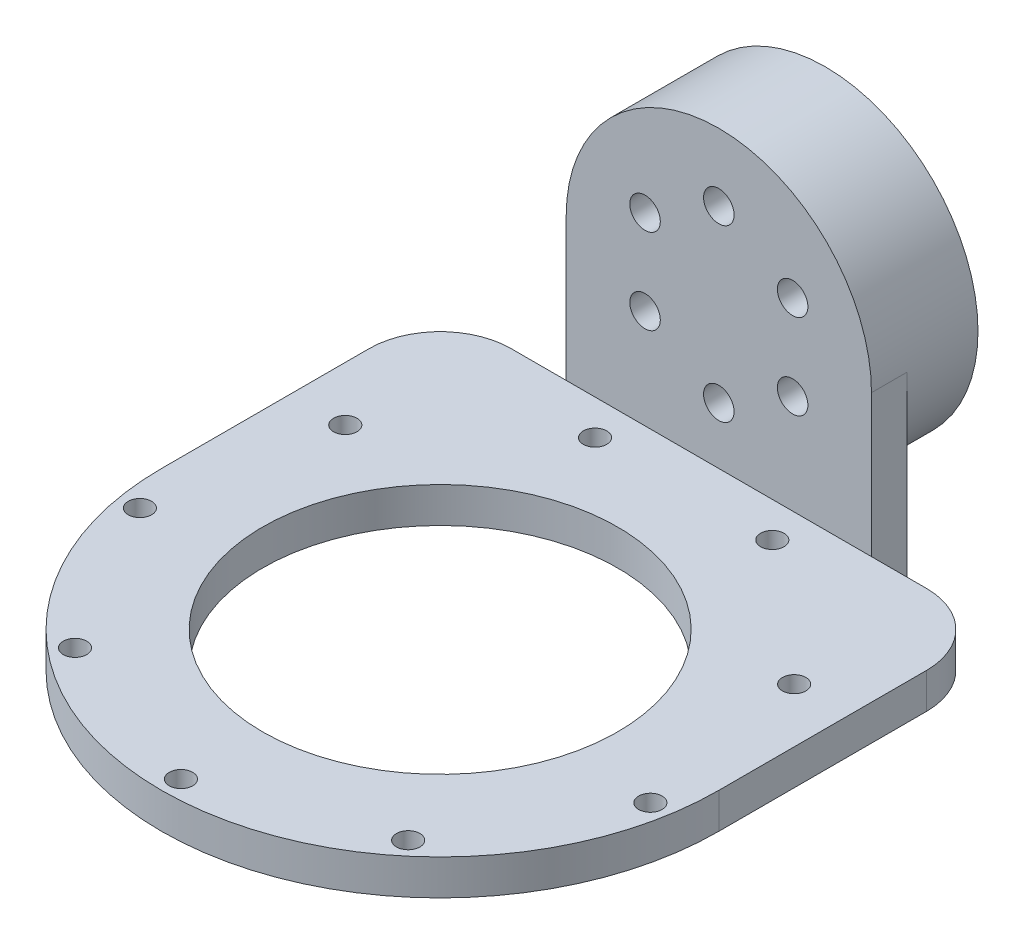
ISO-10303-21;
HEADER;
FILE_DESCRIPTION(('STEP AP214'),'2;1');
FILE_NAME('part.step','',(''),(''),'','','');
FILE_SCHEMA(('AUTOMOTIVE_DESIGN { 1 0 10303 214 1 1 1 1 }'));
ENDSEC;
DATA;
#1=APPLICATION_CONTEXT('core data for automotive mechanical design processes');
#2=APPLICATION_PROTOCOL_DEFINITION('international standard','automotive_design',2000,#1);
#3=PRODUCT_CONTEXT('',#1,'mechanical');
#4=PRODUCT('Part','Part','',(#3));
#5=PRODUCT_RELATED_PRODUCT_CATEGORY('part','',(#4));
#6=PRODUCT_DEFINITION_FORMATION('','',#4);
#7=PRODUCT_DEFINITION_CONTEXT('part definition',#1,'design');
#8=PRODUCT_DEFINITION('design','',#6,#7);
#9=PRODUCT_DEFINITION_SHAPE('','',#8);
#10=(LENGTH_UNIT() NAMED_UNIT(*) SI_UNIT(.MILLI.,.METRE.));
#11=(NAMED_UNIT(*) PLANE_ANGLE_UNIT() SI_UNIT($,.RADIAN.));
#12=(NAMED_UNIT(*) SI_UNIT($,.STERADIAN.) SOLID_ANGLE_UNIT());
#13=UNCERTAINTY_MEASURE_WITH_UNIT(LENGTH_MEASURE(1.E-05),#10,'distance_accuracy_value','');
#14=(GEOMETRIC_REPRESENTATION_CONTEXT(3) GLOBAL_UNCERTAINTY_ASSIGNED_CONTEXT((#13)) GLOBAL_UNIT_ASSIGNED_CONTEXT((#10,
#11,#12)) REPRESENTATION_CONTEXT('',''));
#15=CARTESIAN_POINT('',(0.,0.,0.));
#16=DIRECTION('',(0.,0.,1.));
#17=DIRECTION('',(1.,0.,0.));
#18=AXIS2_PLACEMENT_3D('',#15,#16,#17);
#19=CARTESIAN_POINT('',(0.,0.,15.));
#20=DIRECTION('',(0.,0.,1.));
#21=DIRECTION('',(1.,0.,0.));
#22=AXIS2_PLACEMENT_3D('',#19,#20,#21);
#23=PLANE('',#22);
#24=CARTESIAN_POINT('',(0.,12.,15.));
#25=DIRECTION('',(0.,0.,1.));
#26=DIRECTION('',(1.,0.,0.));
#27=AXIS2_PLACEMENT_3D('',#24,#25,#26);
#28=CIRCLE('',#27,2.15);
#29=CARTESIAN_POINT('',(2.15,12.,15.));
#30=VERTEX_POINT('',#29);
#31=EDGE_CURVE('E335',#30,#30,#28,.T.);
#32=ORIENTED_EDGE('',*,*,#31,.F.);
#33=EDGE_LOOP('',(#32));
#34=FACE_BOUND('',#33,.T.);
#35=CARTESIAN_POINT('',(-10.3923048454133,6.,15.));
#36=DIRECTION('',(0.,0.,1.));
#37=DIRECTION('',(1.,0.,0.));
#38=AXIS2_PLACEMENT_3D('',#35,#36,#37);
#39=CIRCLE('',#38,2.15);
#40=CARTESIAN_POINT('',(-8.24230484541326,6.,15.));
#41=VERTEX_POINT('',#40);
#42=EDGE_CURVE('E371',#41,#41,#39,.T.);
#43=ORIENTED_EDGE('',*,*,#42,.F.);
#44=EDGE_LOOP('',(#43));
#45=FACE_BOUND('',#44,.T.);
#46=CARTESIAN_POINT('',(-10.3923048454133,-6.00000000000001,15.));
#47=DIRECTION('',(0.,0.,1.));
#48=DIRECTION('',(1.,0.,0.));
#49=AXIS2_PLACEMENT_3D('',#46,#47,#48);
#50=CIRCLE('',#49,2.15);
#51=CARTESIAN_POINT('',(-8.24230484541326,-6.00000000000001,15.));
#52=VERTEX_POINT('',#51);
#53=EDGE_CURVE('E363',#52,#52,#50,.T.);
#54=ORIENTED_EDGE('',*,*,#53,.F.);
#55=EDGE_LOOP('',(#54));
#56=FACE_BOUND('',#55,.T.);
#57=CARTESIAN_POINT('',(0.,-12.,15.));
#58=DIRECTION('',(0.,0.,1.));
#59=DIRECTION('',(1.,0.,0.));
#60=AXIS2_PLACEMENT_3D('',#57,#58,#59);
#61=CIRCLE('',#60,2.15);
#62=CARTESIAN_POINT('',(2.15,-12.,15.));
#63=VERTEX_POINT('',#62);
#64=EDGE_CURVE('E355',#63,#63,#61,.T.);
#65=ORIENTED_EDGE('',*,*,#64,.F.);
#66=EDGE_LOOP('',(#65));
#67=FACE_BOUND('',#66,.T.);
#68=CARTESIAN_POINT('',(10.3923048454133,-6.,15.));
#69=DIRECTION('',(0.,0.,1.));
#70=DIRECTION('',(1.,0.,0.));
#71=AXIS2_PLACEMENT_3D('',#68,#69,#70);
#72=CIRCLE('',#71,2.15);
#73=CARTESIAN_POINT('',(12.5423048454133,-6.,15.));
#74=VERTEX_POINT('',#73);
#75=EDGE_CURVE('E347',#74,#74,#72,.T.);
#76=ORIENTED_EDGE('',*,*,#75,.F.);
#77=EDGE_LOOP('',(#76));
#78=FACE_BOUND('',#77,.T.);
#79=CARTESIAN_POINT('',(10.3923048454133,6.,15.));
#80=DIRECTION('',(0.,0.,1.));
#81=DIRECTION('',(1.,0.,0.));
#82=AXIS2_PLACEMENT_3D('',#79,#80,#81);
#83=CIRCLE('',#82,2.15);
#84=CARTESIAN_POINT('',(12.5423048454133,6.,15.));
#85=VERTEX_POINT('',#84);
#86=EDGE_CURVE('E339',#85,#85,#83,.T.);
#87=ORIENTED_EDGE('',*,*,#86,.F.);
#88=EDGE_LOOP('',(#87));
#89=FACE_BOUND('',#88,.T.);
#90=DIRECTION('',(0.,-1.,0.));
#91=VECTOR('',#90,1.);
#92=CARTESIAN_POINT('',(-21.5,0.,15.));
#93=LINE('',#92,#91);
#94=CARTESIAN_POINT('',(-21.5,0.,15.));
#95=VERTEX_POINT('',#94);
#96=CARTESIAN_POINT('',(-21.5,-20.,15.));
#97=VERTEX_POINT('',#96);
#98=EDGE_CURVE('E188',#95,#97,#93,.T.);
#99=ORIENTED_EDGE('',*,*,#98,.T.);
#100=DIRECTION('',(1.,0.,0.));
#101=VECTOR('',#100,1.);
#102=CARTESIAN_POINT('',(-39.25,-20.,15.));
#103=LINE('',#102,#101);
#104=CARTESIAN_POINT('',(21.5,-20.,15.));
#105=VERTEX_POINT('',#104);
#106=EDGE_CURVE('E167',#97,#105,#103,.T.);
#107=ORIENTED_EDGE('',*,*,#106,.T.);
#108=DIRECTION('',(0.,1.,0.));
#109=VECTOR('',#108,1.);
#110=CARTESIAN_POINT('',(21.5,0.,15.));
#111=LINE('',#110,#109);
#112=CARTESIAN_POINT('',(21.5,0.,15.));
#113=VERTEX_POINT('',#112);
#114=EDGE_CURVE('E192',#105,#113,#111,.T.);
#115=ORIENTED_EDGE('',*,*,#114,.T.);
#116=CARTESIAN_POINT('',(0.,0.,15.));
#117=DIRECTION('',(0.,0.,1.));
#118=DIRECTION('',(1.,0.,0.));
#119=AXIS2_PLACEMENT_3D('',#116,#117,#118);
#120=CIRCLE('',#119,21.5);
#121=EDGE_CURVE('E182',#113,#95,#120,.T.);
#122=ORIENTED_EDGE('',*,*,#121,.T.);
#123=EDGE_LOOP('',(#99,#107,#115,#122));
#124=FACE_BOUND('',#123,.T.);
#125=ADVANCED_FACE('F43',(#34,#45,#56,#67,#78,#89,#124),#23,.T.);
#126=CARTESIAN_POINT('',(0.,0.,10.));
#127=DIRECTION('',(0.,0.,-1.));
#128=DIRECTION('',(-1.,0.,0.));
#129=AXIS2_PLACEMENT_3D('',#126,#127,#128);
#130=CYLINDRICAL_SURFACE('',#129,21.5);
#131=CARTESIAN_POINT('',(0.,0.,10.));
#132=DIRECTION('',(0.,0.,1.));
#133=DIRECTION('',(1.,0.,0.));
#134=AXIS2_PLACEMENT_3D('',#131,#132,#133);
#135=CIRCLE('',#134,21.5);
#136=CARTESIAN_POINT('',(-21.5,0.,10.));
#137=VERTEX_POINT('',#136);
#138=CARTESIAN_POINT('',(21.5,0.,10.));
#139=VERTEX_POINT('',#138);
#140=EDGE_CURVE('E222',#137,#139,#135,.T.);
#141=ORIENTED_EDGE('',*,*,#140,.F.);
#142=DIRECTION('',(0.,0.,-1.));
#143=VECTOR('',#142,1.);
#144=CARTESIAN_POINT('',(-21.5,0.,15.));
#145=LINE('',#144,#143);
#146=EDGE_CURVE('E217',#95,#137,#145,.T.);
#147=ORIENTED_EDGE('',*,*,#146,.F.);
#148=ORIENTED_EDGE('',*,*,#121,.F.);
#149=DIRECTION('',(0.,0.,-1.));
#150=VECTOR('',#149,1.);
#151=CARTESIAN_POINT('',(21.5,0.,15.));
#152=LINE('',#151,#150);
#153=EDGE_CURVE('E197',#113,#139,#152,.T.);
#154=ORIENTED_EDGE('',*,*,#153,.T.);
#155=EDGE_LOOP('',(#141,#147,#148,#154));
#156=FACE_BOUND('',#155,.T.);
#157=CARTESIAN_POINT('',(0.,0.,0.));
#158=DIRECTION('',(0.,0.,1.));
#159=DIRECTION('',(1.,0.,0.));
#160=AXIS2_PLACEMENT_3D('',#157,#158,#159);
#161=CIRCLE('',#160,21.5);
#162=CARTESIAN_POINT('',(21.5,0.,0.));
#163=VERTEX_POINT('',#162);
#164=EDGE_CURVE('E221',#163,#163,#161,.T.);
#165=ORIENTED_EDGE('',*,*,#164,.T.);
#166=EDGE_LOOP('',(#165));
#167=FACE_BOUND('',#166,.T.);
#168=ADVANCED_FACE('F394',(#156,#167),#130,.T.);
#169=CARTESIAN_POINT('',(0.,0.,0.));
#170=DIRECTION('',(0.,0.,1.));
#171=DIRECTION('',(1.,0.,0.));
#172=AXIS2_PLACEMENT_3D('',#169,#170,#171);
#173=PLANE('',#172);
#174=CARTESIAN_POINT('',(0.,12.,0.));
#175=DIRECTION('',(0.,0.,1.));
#176=DIRECTION('',(1.,0.,0.));
#177=AXIS2_PLACEMENT_3D('',#174,#175,#176);
#178=CIRCLE('',#177,2.15);
#179=CARTESIAN_POINT('',(2.15,12.,0.));
#180=VERTEX_POINT('',#179);
#181=EDGE_CURVE('E331',#180,#180,#178,.T.);
#182=ORIENTED_EDGE('',*,*,#181,.T.);
#183=EDGE_LOOP('',(#182));
#184=FACE_BOUND('',#183,.T.);
#185=CARTESIAN_POINT('',(-10.3923048454133,6.,0.));
#186=DIRECTION('',(0.,0.,1.));
#187=DIRECTION('',(1.,0.,0.));
#188=AXIS2_PLACEMENT_3D('',#185,#186,#187);
#189=CIRCLE('',#188,2.15);
#190=CARTESIAN_POINT('',(-8.24230484541326,6.,0.));
#191=VERTEX_POINT('',#190);
#192=EDGE_CURVE('E375',#191,#191,#189,.T.);
#193=ORIENTED_EDGE('',*,*,#192,.T.);
#194=EDGE_LOOP('',(#193));
#195=FACE_BOUND('',#194,.T.);
#196=CARTESIAN_POINT('',(-10.3923048454133,-6.00000000000001,0.));
#197=DIRECTION('',(0.,0.,1.));
#198=DIRECTION('',(1.,0.,0.));
#199=AXIS2_PLACEMENT_3D('',#196,#197,#198);
#200=CIRCLE('',#199,2.15);
#201=CARTESIAN_POINT('',(-8.24230484541326,-6.00000000000001,0.));
#202=VERTEX_POINT('',#201);
#203=EDGE_CURVE('E367',#202,#202,#200,.T.);
#204=ORIENTED_EDGE('',*,*,#203,.T.);
#205=EDGE_LOOP('',(#204));
#206=FACE_BOUND('',#205,.T.);
#207=CARTESIAN_POINT('',(0.,-12.,0.));
#208=DIRECTION('',(0.,0.,1.));
#209=DIRECTION('',(1.,0.,0.));
#210=AXIS2_PLACEMENT_3D('',#207,#208,#209);
#211=CIRCLE('',#210,2.15);
#212=CARTESIAN_POINT('',(2.15,-12.,0.));
#213=VERTEX_POINT('',#212);
#214=EDGE_CURVE('E359',#213,#213,#211,.T.);
#215=ORIENTED_EDGE('',*,*,#214,.T.);
#216=EDGE_LOOP('',(#215));
#217=FACE_BOUND('',#216,.T.);
#218=CARTESIAN_POINT('',(10.3923048454133,-6.,0.));
#219=DIRECTION('',(0.,0.,1.));
#220=DIRECTION('',(1.,0.,0.));
#221=AXIS2_PLACEMENT_3D('',#218,#219,#220);
#222=CIRCLE('',#221,2.15);
#223=CARTESIAN_POINT('',(12.5423048454133,-6.,0.));
#224=VERTEX_POINT('',#223);
#225=EDGE_CURVE('E351',#224,#224,#222,.T.);
#226=ORIENTED_EDGE('',*,*,#225,.T.);
#227=EDGE_LOOP('',(#226));
#228=FACE_BOUND('',#227,.T.);
#229=CARTESIAN_POINT('',(10.3923048454133,6.,0.));
#230=DIRECTION('',(0.,0.,1.));
#231=DIRECTION('',(1.,0.,0.));
#232=AXIS2_PLACEMENT_3D('',#229,#230,#231);
#233=CIRCLE('',#232,2.15);
#234=CARTESIAN_POINT('',(12.5423048454133,6.,0.));
#235=VERTEX_POINT('',#234);
#236=EDGE_CURVE('E343',#235,#235,#233,.T.);
#237=ORIENTED_EDGE('',*,*,#236,.T.);
#238=EDGE_LOOP('',(#237));
#239=FACE_BOUND('',#238,.T.);
#240=ORIENTED_EDGE('',*,*,#164,.F.);
#241=EDGE_LOOP('',(#240));
#242=FACE_BOUND('',#241,.T.);
#243=ADVANCED_FACE('F381',(#184,#195,#206,#217,#228,#239,#242),#173,.F.);
#244=CARTESIAN_POINT('',(0.,0.,10.));
#245=DIRECTION('',(0.,0.,1.));
#246=DIRECTION('',(1.,0.,0.));
#247=AXIS2_PLACEMENT_3D('',#244,#245,#246);
#248=PLANE('',#247);
#249=DIRECTION('',(0.,-1.,0.));
#250=VECTOR('',#249,1.);
#251=CARTESIAN_POINT('',(-21.5,0.,10.));
#252=LINE('',#251,#250);
#253=CARTESIAN_POINT('',(-21.5,-25.,10.));
#254=VERTEX_POINT('',#253);
#255=EDGE_CURVE('E180',#137,#254,#252,.T.);
#256=ORIENTED_EDGE('',*,*,#255,.F.);
#257=ORIENTED_EDGE('',*,*,#140,.T.);
#258=DIRECTION('',(0.,1.,0.));
#259=VECTOR('',#258,1.);
#260=CARTESIAN_POINT('',(21.5,0.,10.));
#261=LINE('',#260,#259);
#262=CARTESIAN_POINT('',(21.5,-25.,10.));
#263=VERTEX_POINT('',#262);
#264=EDGE_CURVE('E187',#263,#139,#261,.T.);
#265=ORIENTED_EDGE('',*,*,#264,.F.);
#266=DIRECTION('',(1.,0.,0.));
#267=VECTOR('',#266,1.);
#268=CARTESIAN_POINT('',(21.5,-25.,10.));
#269=LINE('',#268,#267);
#270=EDGE_CURVE('E200',#254,#263,#269,.T.);
#271=ORIENTED_EDGE('',*,*,#270,.F.);
#272=EDGE_LOOP('',(#256,#257,#265,#271));
#273=FACE_BOUND('',#272,.T.);
#274=ADVANCED_FACE('F430',(#273),#248,.F.);
#275=CARTESIAN_POINT('',(-21.5,0.,15.));
#276=DIRECTION('',(1.,0.,0.));
#277=DIRECTION('',(0.,1.,0.));
#278=AXIS2_PLACEMENT_3D('',#275,#276,#277);
#279=PLANE('',#278);
#280=ORIENTED_EDGE('',*,*,#255,.T.);
#281=DIRECTION('',(0.,0.,-1.));
#282=VECTOR('',#281,1.);
#283=CARTESIAN_POINT('',(-21.5,-25.,15.));
#284=LINE('',#283,#282);
#285=CARTESIAN_POINT('',(-21.5,-25.,15.));
#286=VERTEX_POINT('',#285);
#287=EDGE_CURVE('E213',#286,#254,#284,.T.);
#288=ORIENTED_EDGE('',*,*,#287,.F.);
#289=EDGE_CURVE('E186',#97,#286,#93,.T.);
#290=ORIENTED_EDGE('',*,*,#289,.F.);
#291=ORIENTED_EDGE('',*,*,#98,.F.);
#292=ORIENTED_EDGE('',*,*,#146,.T.);
#293=EDGE_LOOP('',(#280,#288,#290,#291,#292));
#294=FACE_BOUND('',#293,.T.);
#295=ADVANCED_FACE('F412',(#294),#279,.F.);
#296=CARTESIAN_POINT('',(21.5,-25.,15.));
#297=DIRECTION('',(0.,1.,0.));
#298=DIRECTION('',(0.,0.,1.));
#299=AXIS2_PLACEMENT_3D('',#296,#297,#298);
#300=PLANE('',#299);
#301=CARTESIAN_POINT('',(0.,-25.,90.75));
#302=DIRECTION('',(0.,1.,0.));
#303=DIRECTION('',(0.,0.,1.));
#304=AXIS2_PLACEMENT_3D('',#301,#302,#303);
#305=CIRCLE('',#304,1.65);
#306=CARTESIAN_POINT('',(0.,-25.,92.4));
#307=VERTEX_POINT('',#306);
#308=EDGE_CURVE('E260',#307,#307,#305,.T.);
#309=ORIENTED_EDGE('',*,*,#308,.T.);
#310=EDGE_LOOP('',(#309));
#311=FACE_BOUND('',#310,.T.);
#312=CARTESIAN_POINT('',(-23.4617477535587,-25.,82.2106221738427));
#313=DIRECTION('',(0.,1.,0.));
#314=DIRECTION('',(0.,0.,1.));
#315=AXIS2_PLACEMENT_3D('',#312,#313,#314);
#316=CIRCLE('',#315,1.65000000000001);
#317=CARTESIAN_POINT('',(-23.4617477535587,-25.,83.8606221738427));
#318=VERTEX_POINT('',#317);
#319=EDGE_CURVE('E271',#318,#318,#316,.T.);
#320=ORIENTED_EDGE('',*,*,#319,.T.);
#321=EDGE_LOOP('',(#320));
#322=FACE_BOUND('',#321,.T.);
#323=CARTESIAN_POINT('',(-35.9454829849456,-25.,60.5881584848429));
#324=DIRECTION('',(0.,1.,0.));
#325=DIRECTION('',(0.,0.,1.));
#326=AXIS2_PLACEMENT_3D('',#323,#324,#325);
#327=CIRCLE('',#326,1.65);
#328=CARTESIAN_POINT('',(-35.9454829849456,-25.,62.2381584848429));
#329=VERTEX_POINT('',#328);
#330=EDGE_CURVE('E279',#329,#329,#327,.T.);
#331=ORIENTED_EDGE('',*,*,#330,.T.);
#332=EDGE_LOOP('',(#331));
#333=FACE_BOUND('',#332,.T.);
#334=CARTESIAN_POINT('',(-31.609927238132,-25.,35.9999999999999));
#335=DIRECTION('',(0.,1.,0.));
#336=DIRECTION('',(0.,0.,1.));
#337=AXIS2_PLACEMENT_3D('',#334,#335,#336);
#338=CIRCLE('',#337,1.65);
#339=CARTESIAN_POINT('',(-31.609927238132,-25.,37.6499999999999));
#340=VERTEX_POINT('',#339);
#341=EDGE_CURVE('E287',#340,#340,#338,.T.);
#342=ORIENTED_EDGE('',*,*,#341,.T.);
#343=EDGE_LOOP('',(#342));
#344=FACE_BOUND('',#343,.T.);
#345=CARTESIAN_POINT('',(-12.4837352313867,-25.,19.9512193413143));
#346=DIRECTION('',(0.,1.,0.));
#347=DIRECTION('',(0.,0.,1.));
#348=AXIS2_PLACEMENT_3D('',#345,#346,#347);
#349=CIRCLE('',#348,1.65000000000001);
#350=CARTESIAN_POINT('',(-12.4837352313867,-25.,21.6012193413143));
#351=VERTEX_POINT('',#350);
#352=EDGE_CURVE('E295',#351,#351,#349,.T.);
#353=ORIENTED_EDGE('',*,*,#352,.T.);
#354=EDGE_LOOP('',(#353));
#355=FACE_BOUND('',#354,.T.);
#356=CARTESIAN_POINT('',(12.4837352313871,-25.,19.9512193413144));
#357=DIRECTION('',(0.,1.,0.));
#358=DIRECTION('',(0.,0.,1.));
#359=AXIS2_PLACEMENT_3D('',#356,#357,#358);
#360=CIRCLE('',#359,1.65);
#361=CARTESIAN_POINT('',(12.4837352313871,-25.,21.6012193413144));
#362=VERTEX_POINT('',#361);
#363=EDGE_CURVE('E303',#362,#362,#360,.T.);
#364=ORIENTED_EDGE('',*,*,#363,.T.);
#365=EDGE_LOOP('',(#364));
#366=FACE_BOUND('',#365,.T.);
#367=CARTESIAN_POINT('',(31.6099272381322,-25.,36.0000000000003));
#368=DIRECTION('',(0.,1.,0.));
#369=DIRECTION('',(0.,0.,1.));
#370=AXIS2_PLACEMENT_3D('',#367,#368,#369);
#371=CIRCLE('',#370,1.65000000000001);
#372=CARTESIAN_POINT('',(31.6099272381322,-25.,37.6500000000003));
#373=VERTEX_POINT('',#372);
#374=EDGE_CURVE('E311',#373,#373,#371,.T.);
#375=ORIENTED_EDGE('',*,*,#374,.T.);
#376=EDGE_LOOP('',(#375));
#377=FACE_BOUND('',#376,.T.);
#378=CARTESIAN_POINT('',(35.9454829849455,-25.,60.5881584848433));
#379=DIRECTION('',(0.,1.,0.));
#380=DIRECTION('',(0.,0.,1.));
#381=AXIS2_PLACEMENT_3D('',#378,#379,#380);
#382=CIRCLE('',#381,1.65);
#383=CARTESIAN_POINT('',(35.9454829849455,-25.,62.2381584848433));
#384=VERTEX_POINT('',#383);
#385=EDGE_CURVE('E319',#384,#384,#382,.T.);
#386=ORIENTED_EDGE('',*,*,#385,.T.);
#387=EDGE_LOOP('',(#386));
#388=FACE_BOUND('',#387,.T.);
#389=CARTESIAN_POINT('',(23.4617477535583,-25.,82.210622173843));
#390=DIRECTION('',(0.,1.,0.));
#391=DIRECTION('',(0.,0.,1.));
#392=AXIS2_PLACEMENT_3D('',#389,#390,#391);
#393=CIRCLE('',#392,1.65);
#394=CARTESIAN_POINT('',(23.4617477535583,-25.,83.860622173843));
#395=VERTEX_POINT('',#394);
#396=EDGE_CURVE('E327',#395,#395,#393,.T.);
#397=ORIENTED_EDGE('',*,*,#396,.T.);
#398=EDGE_LOOP('',(#397));
#399=FACE_BOUND('',#398,.T.);
#400=CARTESIAN_POINT('',(0.,-25.,54.25));
#401=DIRECTION('',(0.,1.,0.));
#402=DIRECTION('',(0.,0.,1.));
#403=AXIS2_PLACEMENT_3D('',#400,#401,#402);
#404=CIRCLE('',#403,25.);
#405=CARTESIAN_POINT('',(0.,-25.,79.25));
#406=VERTEX_POINT('',#405);
#407=EDGE_CURVE('E173',#406,#406,#404,.T.);
#408=ORIENTED_EDGE('',*,*,#407,.T.);
#409=EDGE_LOOP('',(#408));
#410=FACE_BOUND('',#409,.T.);
#411=DIRECTION('',(0.,0.,-1.));
#412=VECTOR('',#411,1.);
#413=CARTESIAN_POINT('',(-39.25,-25.,54.25));
#414=LINE('',#413,#412);
#415=CARTESIAN_POINT('',(-39.25,-25.,54.25));
#416=VERTEX_POINT('',#415);
#417=CARTESIAN_POINT('',(-39.25,-25.,25.));
#418=VERTEX_POINT('',#417);
#419=EDGE_CURVE('E133',#416,#418,#414,.T.);
#420=ORIENTED_EDGE('',*,*,#419,.T.);
#421=CARTESIAN_POINT('',(-29.25,-25.,25.));
#422=DIRECTION('',(0.,1.,0.));
#423=DIRECTION('',(0.,0.,1.));
#424=AXIS2_PLACEMENT_3D('',#421,#422,#423);
#425=CIRCLE('',#424,10.);
#426=CARTESIAN_POINT('',(-29.25,-25.,15.));
#427=VERTEX_POINT('',#426);
#428=EDGE_CURVE('E234',#418,#427,#425,.F.);
#429=ORIENTED_EDGE('',*,*,#428,.T.);
#430=DIRECTION('',(1.,0.,0.));
#431=VECTOR('',#430,1.);
#432=CARTESIAN_POINT('',(-39.25,-25.,15.));
#433=LINE('',#432,#431);
#434=EDGE_CURVE('E158',#427,#286,#433,.T.);
#435=ORIENTED_EDGE('',*,*,#434,.T.);
#436=ORIENTED_EDGE('',*,*,#287,.T.);
#437=ORIENTED_EDGE('',*,*,#270,.T.);
#438=DIRECTION('',(0.,0.,-1.));
#439=VECTOR('',#438,1.);
#440=CARTESIAN_POINT('',(21.5,-25.,15.));
#441=LINE('',#440,#439);
#442=CARTESIAN_POINT('',(21.5,-25.,15.));
#443=VERTEX_POINT('',#442);
#444=EDGE_CURVE('E209',#443,#263,#441,.T.);
#445=ORIENTED_EDGE('',*,*,#444,.F.);
#446=CARTESIAN_POINT('',(29.25,-25.,15.));
#447=VERTEX_POINT('',#446);
#448=EDGE_CURVE('E176',#443,#447,#433,.T.);
#449=ORIENTED_EDGE('',*,*,#448,.T.);
#450=CARTESIAN_POINT('',(29.25,-25.,25.));
#451=DIRECTION('',(0.,1.,0.));
#452=DIRECTION('',(0.,0.,1.));
#453=AXIS2_PLACEMENT_3D('',#450,#451,#452);
#454=CIRCLE('',#453,10.);
#455=CARTESIAN_POINT('',(39.25,-25.,25.));
#456=VERTEX_POINT('',#455);
#457=EDGE_CURVE('E231',#447,#456,#454,.F.);
#458=ORIENTED_EDGE('',*,*,#457,.T.);
#459=DIRECTION('',(0.,0.,1.));
#460=VECTOR('',#459,1.);
#461=CARTESIAN_POINT('',(39.25,-25.,15.));
#462=LINE('',#461,#460);
#463=CARTESIAN_POINT('',(39.25,-25.,54.25));
#464=VERTEX_POINT('',#463);
#465=EDGE_CURVE('E155',#456,#464,#462,.T.);
#466=ORIENTED_EDGE('',*,*,#465,.T.);
#467=CARTESIAN_POINT('',(0.,-25.,54.25));
#468=DIRECTION('',(0.,-1.,0.));
#469=DIRECTION('',(0.,0.,-1.));
#470=AXIS2_PLACEMENT_3D('',#467,#468,#469);
#471=CIRCLE('',#470,39.25);
#472=EDGE_CURVE('E170',#464,#416,#471,.T.);
#473=ORIENTED_EDGE('',*,*,#472,.T.);
#474=EDGE_LOOP('',(#420,#429,#435,#436,#437,#445,#449,#458,#466,#473));
#475=FACE_BOUND('',#474,.T.);
#476=ADVANCED_FACE('F252',(#311,#322,#333,#344,#355,#366,#377,#388,#399,#410,#475),#300,.F.);
#477=CARTESIAN_POINT('',(21.5,0.,15.));
#478=DIRECTION('',(-1.,0.,0.));
#479=DIRECTION('',(0.,-1.,0.));
#480=AXIS2_PLACEMENT_3D('',#477,#478,#479);
#481=PLANE('',#480);
#482=ORIENTED_EDGE('',*,*,#264,.T.);
#483=ORIENTED_EDGE('',*,*,#153,.F.);
#484=ORIENTED_EDGE('',*,*,#114,.F.);
#485=EDGE_CURVE('E193',#443,#105,#111,.T.);
#486=ORIENTED_EDGE('',*,*,#485,.F.);
#487=ORIENTED_EDGE('',*,*,#444,.T.);
#488=EDGE_LOOP('',(#482,#483,#484,#486,#487));
#489=FACE_BOUND('',#488,.T.);
#490=ADVANCED_FACE('F423',(#489),#481,.F.);
#491=CARTESIAN_POINT('',(-39.25,-20.,15.));
#492=DIRECTION('',(0.,0.,-1.));
#493=DIRECTION('',(-1.,0.,0.));
#494=AXIS2_PLACEMENT_3D('',#491,#492,#493);
#495=PLANE('',#494);
#496=ORIENTED_EDGE('',*,*,#434,.F.);
#497=DIRECTION('',(0.,-1.,0.));
#498=VECTOR('',#497,1.);
#499=CARTESIAN_POINT('',(-29.25,-20.,15.));
#500=LINE('',#499,#498);
#501=CARTESIAN_POINT('',(-29.25,-20.,15.));
#502=VERTEX_POINT('',#501);
#503=EDGE_CURVE('E237',#427,#502,#500,.F.);
#504=ORIENTED_EDGE('',*,*,#503,.T.);
#505=EDGE_CURVE('E164',#502,#97,#103,.T.);
#506=ORIENTED_EDGE('',*,*,#505,.T.);
#507=ORIENTED_EDGE('',*,*,#289,.T.);
#508=EDGE_LOOP('',(#496,#504,#506,#507));
#509=FACE_BOUND('',#508,.T.);
#510=ADVANCED_FACE('F432',(#509),#495,.T.);
#511=CARTESIAN_POINT('',(0.,-20.,54.25));
#512=DIRECTION('',(0.,-1.,0.));
#513=DIRECTION('',(0.,0.,-1.));
#514=AXIS2_PLACEMENT_3D('',#511,#512,#513);
#515=CYLINDRICAL_SURFACE('',#514,39.25);
#516=ORIENTED_EDGE('',*,*,#472,.F.);
#517=DIRECTION('',(0.,-1.,0.));
#518=VECTOR('',#517,1.);
#519=CARTESIAN_POINT('',(39.25,-20.,54.25));
#520=LINE('',#519,#518);
#521=CARTESIAN_POINT('',(39.25,-20.,54.25));
#522=VERTEX_POINT('',#521);
#523=EDGE_CURVE('E139',#522,#464,#520,.T.);
#524=ORIENTED_EDGE('',*,*,#523,.F.);
#525=CARTESIAN_POINT('',(0.,-20.,54.25));
#526=DIRECTION('',(0.,-1.,0.));
#527=DIRECTION('',(0.,0.,-1.));
#528=AXIS2_PLACEMENT_3D('',#525,#526,#527);
#529=CIRCLE('',#528,39.25);
#530=CARTESIAN_POINT('',(-39.25,-20.,54.25));
#531=VERTEX_POINT('',#530);
#532=EDGE_CURVE('E145',#522,#531,#529,.T.);
#533=ORIENTED_EDGE('',*,*,#532,.T.);
#534=DIRECTION('',(0.,-1.,0.));
#535=VECTOR('',#534,1.);
#536=CARTESIAN_POINT('',(-39.25,-20.,54.25));
#537=LINE('',#536,#535);
#538=EDGE_CURVE('E126',#531,#416,#537,.T.);
#539=ORIENTED_EDGE('',*,*,#538,.T.);
#540=EDGE_LOOP('',(#516,#524,#533,#539));
#541=FACE_BOUND('',#540,.T.);
#542=ADVANCED_FACE('F152',(#541),#515,.T.);
#543=CARTESIAN_POINT('',(39.25,-20.,15.));
#544=DIRECTION('',(1.,0.,0.));
#545=DIRECTION('',(0.,0.,-1.));
#546=AXIS2_PLACEMENT_3D('',#543,#544,#545);
#547=PLANE('',#546);
#548=ORIENTED_EDGE('',*,*,#465,.F.);
#549=DIRECTION('',(0.,-1.,0.));
#550=VECTOR('',#549,1.);
#551=CARTESIAN_POINT('',(39.25,-20.,25.));
#552=LINE('',#551,#550);
#553=CARTESIAN_POINT('',(39.25,-20.,25.));
#554=VERTEX_POINT('',#553);
#555=EDGE_CURVE('E11',#456,#554,#552,.F.);
#556=ORIENTED_EDGE('',*,*,#555,.T.);
#557=DIRECTION('',(0.,0.,1.));
#558=VECTOR('',#557,1.);
#559=CARTESIAN_POINT('',(39.25,-20.,15.));
#560=LINE('',#559,#558);
#561=EDGE_CURVE('E140',#554,#522,#560,.T.);
#562=ORIENTED_EDGE('',*,*,#561,.T.);
#563=ORIENTED_EDGE('',*,*,#523,.T.);
#564=EDGE_LOOP('',(#548,#556,#562,#563));
#565=FACE_BOUND('',#564,.T.);
#566=ADVANCED_FACE('F435',(#565),#547,.T.);
#567=CARTESIAN_POINT('',(29.25,-20.,15.));
#568=VERTEX_POINT('',#567);
#569=EDGE_CURVE('E149',#105,#568,#103,.T.);
#570=ORIENTED_EDGE('',*,*,#569,.T.);
#571=DIRECTION('',(0.,-1.,0.));
#572=VECTOR('',#571,1.);
#573=CARTESIAN_POINT('',(29.25,-20.,15.));
#574=LINE('',#573,#572);
#575=EDGE_CURVE('E52',#568,#447,#574,.T.);
#576=ORIENTED_EDGE('',*,*,#575,.T.);
#577=ORIENTED_EDGE('',*,*,#448,.F.);
#578=ORIENTED_EDGE('',*,*,#485,.T.);
#579=EDGE_LOOP('',(#570,#576,#577,#578));
#580=FACE_BOUND('',#579,.T.);
#581=ADVANCED_FACE('F248',(#580),#495,.T.);
#582=CARTESIAN_POINT('',(-39.25,-20.,54.25));
#583=DIRECTION('',(-1.,0.,0.));
#584=DIRECTION('',(0.,0.,1.));
#585=AXIS2_PLACEMENT_3D('',#582,#583,#584);
#586=PLANE('',#585);
#587=DIRECTION('',(0.,0.,-1.));
#588=VECTOR('',#587,1.);
#589=CARTESIAN_POINT('',(-39.25,-20.,54.25));
#590=LINE('',#589,#588);
#591=CARTESIAN_POINT('',(-39.25,-20.,25.));
#592=VERTEX_POINT('',#591);
#593=EDGE_CURVE('E130',#531,#592,#590,.T.);
#594=ORIENTED_EDGE('',*,*,#593,.T.);
#595=DIRECTION('',(0.,-1.,0.));
#596=VECTOR('',#595,1.);
#597=CARTESIAN_POINT('',(-39.25,-20.,25.));
#598=LINE('',#597,#596);
#599=EDGE_CURVE('E228',#592,#418,#598,.T.);
#600=ORIENTED_EDGE('',*,*,#599,.T.);
#601=ORIENTED_EDGE('',*,*,#419,.F.);
#602=ORIENTED_EDGE('',*,*,#538,.F.);
#603=EDGE_LOOP('',(#594,#600,#601,#602));
#604=FACE_BOUND('',#603,.T.);
#605=ADVANCED_FACE('F128',(#604),#586,.T.);
#606=CARTESIAN_POINT('',(0.,-20.,54.25));
#607=DIRECTION('',(0.,-1.,0.));
#608=DIRECTION('',(0.,0.,-1.));
#609=AXIS2_PLACEMENT_3D('',#606,#607,#608);
#610=PLANE('',#609);
#611=CARTESIAN_POINT('',(0.,-20.,90.75));
#612=DIRECTION('',(0.,1.,0.));
#613=DIRECTION('',(0.,0.,1.));
#614=AXIS2_PLACEMENT_3D('',#611,#612,#613);
#615=CIRCLE('',#614,1.65);
#616=CARTESIAN_POINT('',(0.,-20.,92.4));
#617=VERTEX_POINT('',#616);
#618=EDGE_CURVE('E263',#617,#617,#615,.T.);
#619=ORIENTED_EDGE('',*,*,#618,.F.);
#620=EDGE_LOOP('',(#619));
#621=FACE_BOUND('',#620,.T.);
#622=CARTESIAN_POINT('',(-23.4617477535587,-20.,82.2106221738427));
#623=DIRECTION('',(0.,1.,0.));
#624=DIRECTION('',(0.,0.,1.));
#625=AXIS2_PLACEMENT_3D('',#622,#623,#624);
#626=CIRCLE('',#625,1.65000000000001);
#627=CARTESIAN_POINT('',(-23.4617477535587,-20.,83.8606221738427));
#628=VERTEX_POINT('',#627);
#629=EDGE_CURVE('E267',#628,#628,#626,.T.);
#630=ORIENTED_EDGE('',*,*,#629,.F.);
#631=EDGE_LOOP('',(#630));
#632=FACE_BOUND('',#631,.T.);
#633=CARTESIAN_POINT('',(-35.9454829849456,-20.,60.5881584848429));
#634=DIRECTION('',(0.,1.,0.));
#635=DIRECTION('',(0.,0.,1.));
#636=AXIS2_PLACEMENT_3D('',#633,#634,#635);
#637=CIRCLE('',#636,1.65);
#638=CARTESIAN_POINT('',(-35.9454829849456,-20.,62.2381584848429));
#639=VERTEX_POINT('',#638);
#640=EDGE_CURVE('E275',#639,#639,#637,.T.);
#641=ORIENTED_EDGE('',*,*,#640,.F.);
#642=EDGE_LOOP('',(#641));
#643=FACE_BOUND('',#642,.T.);
#644=CARTESIAN_POINT('',(-31.609927238132,-20.,35.9999999999999));
#645=DIRECTION('',(0.,1.,0.));
#646=DIRECTION('',(0.,0.,1.));
#647=AXIS2_PLACEMENT_3D('',#644,#645,#646);
#648=CIRCLE('',#647,1.65);
#649=CARTESIAN_POINT('',(-31.609927238132,-20.,37.6499999999999));
#650=VERTEX_POINT('',#649);
#651=EDGE_CURVE('E283',#650,#650,#648,.T.);
#652=ORIENTED_EDGE('',*,*,#651,.F.);
#653=EDGE_LOOP('',(#652));
#654=FACE_BOUND('',#653,.T.);
#655=CARTESIAN_POINT('',(-12.4837352313867,-20.,19.9512193413143));
#656=DIRECTION('',(0.,1.,0.));
#657=DIRECTION('',(0.,0.,1.));
#658=AXIS2_PLACEMENT_3D('',#655,#656,#657);
#659=CIRCLE('',#658,1.65000000000001);
#660=CARTESIAN_POINT('',(-12.4837352313867,-20.,21.6012193413143));
#661=VERTEX_POINT('',#660);
#662=EDGE_CURVE('E291',#661,#661,#659,.T.);
#663=ORIENTED_EDGE('',*,*,#662,.F.);
#664=EDGE_LOOP('',(#663));
#665=FACE_BOUND('',#664,.T.);
#666=CARTESIAN_POINT('',(12.4837352313871,-20.,19.9512193413144));
#667=DIRECTION('',(0.,1.,0.));
#668=DIRECTION('',(0.,0.,1.));
#669=AXIS2_PLACEMENT_3D('',#666,#667,#668);
#670=CIRCLE('',#669,1.65);
#671=CARTESIAN_POINT('',(12.4837352313871,-20.,21.6012193413144));
#672=VERTEX_POINT('',#671);
#673=EDGE_CURVE('E299',#672,#672,#670,.T.);
#674=ORIENTED_EDGE('',*,*,#673,.F.);
#675=EDGE_LOOP('',(#674));
#676=FACE_BOUND('',#675,.T.);
#677=CARTESIAN_POINT('',(31.6099272381322,-20.,36.0000000000003));
#678=DIRECTION('',(0.,1.,0.));
#679=DIRECTION('',(0.,0.,1.));
#680=AXIS2_PLACEMENT_3D('',#677,#678,#679);
#681=CIRCLE('',#680,1.65000000000001);
#682=CARTESIAN_POINT('',(31.6099272381322,-20.,37.6500000000003));
#683=VERTEX_POINT('',#682);
#684=EDGE_CURVE('E307',#683,#683,#681,.T.);
#685=ORIENTED_EDGE('',*,*,#684,.F.);
#686=EDGE_LOOP('',(#685));
#687=FACE_BOUND('',#686,.T.);
#688=CARTESIAN_POINT('',(35.9454829849455,-20.,60.5881584848433));
#689=DIRECTION('',(0.,1.,0.));
#690=DIRECTION('',(0.,0.,1.));
#691=AXIS2_PLACEMENT_3D('',#688,#689,#690);
#692=CIRCLE('',#691,1.65);
#693=CARTESIAN_POINT('',(35.9454829849455,-20.,62.2381584848433));
#694=VERTEX_POINT('',#693);
#695=EDGE_CURVE('E315',#694,#694,#692,.T.);
#696=ORIENTED_EDGE('',*,*,#695,.F.);
#697=EDGE_LOOP('',(#696));
#698=FACE_BOUND('',#697,.T.);
#699=CARTESIAN_POINT('',(23.4617477535583,-20.,82.210622173843));
#700=DIRECTION('',(0.,1.,0.));
#701=DIRECTION('',(0.,0.,1.));
#702=AXIS2_PLACEMENT_3D('',#699,#700,#701);
#703=CIRCLE('',#702,1.65);
#704=CARTESIAN_POINT('',(23.4617477535583,-20.,83.860622173843));
#705=VERTEX_POINT('',#704);
#706=EDGE_CURVE('E323',#705,#705,#703,.T.);
#707=ORIENTED_EDGE('',*,*,#706,.F.);
#708=EDGE_LOOP('',(#707));
#709=FACE_BOUND('',#708,.T.);
#710=CARTESIAN_POINT('',(0.,-20.,54.25));
#711=DIRECTION('',(0.,1.,0.));
#712=DIRECTION('',(0.,0.,1.));
#713=AXIS2_PLACEMENT_3D('',#710,#711,#712);
#714=CIRCLE('',#713,25.);
#715=CARTESIAN_POINT('',(0.,-20.,79.25));
#716=VERTEX_POINT('',#715);
#717=EDGE_CURVE('E161',#716,#716,#714,.T.);
#718=ORIENTED_EDGE('',*,*,#717,.F.);
#719=EDGE_LOOP('',(#718));
#720=FACE_BOUND('',#719,.T.);
#721=ORIENTED_EDGE('',*,*,#505,.F.);
#722=CARTESIAN_POINT('',(-29.25,-20.,25.));
#723=DIRECTION('',(0.,-1.,0.));
#724=DIRECTION('',(0.,0.,-1.));
#725=AXIS2_PLACEMENT_3D('',#722,#723,#724);
#726=CIRCLE('',#725,10.);
#727=EDGE_CURVE('E147',#502,#592,#726,.F.);
#728=ORIENTED_EDGE('',*,*,#727,.T.);
#729=ORIENTED_EDGE('',*,*,#593,.F.);
#730=ORIENTED_EDGE('',*,*,#532,.F.);
#731=ORIENTED_EDGE('',*,*,#561,.F.);
#732=CARTESIAN_POINT('',(29.25,-20.,25.));
#733=DIRECTION('',(0.,-1.,0.));
#734=DIRECTION('',(0.,0.,-1.));
#735=AXIS2_PLACEMENT_3D('',#732,#733,#734);
#736=CIRCLE('',#735,10.);
#737=EDGE_CURVE('E59',#554,#568,#736,.F.);
#738=ORIENTED_EDGE('',*,*,#737,.T.);
#739=ORIENTED_EDGE('',*,*,#569,.F.);
#740=ORIENTED_EDGE('',*,*,#106,.F.);
#741=EDGE_LOOP('',(#721,#728,#729,#730,#731,#738,#739,#740));
#742=FACE_BOUND('',#741,.T.);
#743=ADVANCED_FACE('F144',(#621,#632,#643,#654,#665,#676,#687,#698,#709,#720,#742),#610,.F.);
#744=CARTESIAN_POINT('',(-29.25,-20.,25.));
#745=DIRECTION('',(0.,-1.,0.));
#746=DIRECTION('',(0.,0.,-1.));
#747=AXIS2_PLACEMENT_3D('',#744,#745,#746);
#748=CYLINDRICAL_SURFACE('',#747,10.);
#749=ORIENTED_EDGE('',*,*,#727,.F.);
#750=ORIENTED_EDGE('',*,*,#503,.F.);
#751=ORIENTED_EDGE('',*,*,#428,.F.);
#752=ORIENTED_EDGE('',*,*,#599,.F.);
#753=EDGE_LOOP('',(#749,#750,#751,#752));
#754=FACE_BOUND('',#753,.T.);
#755=ADVANCED_FACE('F434',(#754),#748,.T.);
#756=CARTESIAN_POINT('',(29.25,-20.,25.));
#757=DIRECTION('',(0.,-1.,0.));
#758=DIRECTION('',(0.,0.,-1.));
#759=AXIS2_PLACEMENT_3D('',#756,#757,#758);
#760=CYLINDRICAL_SURFACE('',#759,10.);
#761=ORIENTED_EDGE('',*,*,#737,.F.);
#762=ORIENTED_EDGE('',*,*,#555,.F.);
#763=ORIENTED_EDGE('',*,*,#457,.F.);
#764=ORIENTED_EDGE('',*,*,#575,.F.);
#765=EDGE_LOOP('',(#761,#762,#763,#764));
#766=FACE_BOUND('',#765,.T.);
#767=ADVANCED_FACE('F45',(#766),#760,.T.);
#768=CARTESIAN_POINT('',(0.,-25.,54.25));
#769=DIRECTION('',(0.,1.,0.));
#770=DIRECTION('',(0.,0.,1.));
#771=AXIS2_PLACEMENT_3D('',#768,#769,#770);
#772=CYLINDRICAL_SURFACE('',#771,25.);
#773=ORIENTED_EDGE('',*,*,#407,.F.);
#774=EDGE_LOOP('',(#773));
#775=FACE_BOUND('',#774,.T.);
#776=ORIENTED_EDGE('',*,*,#717,.T.);
#777=EDGE_LOOP('',(#776));
#778=FACE_BOUND('',#777,.T.);
#779=ADVANCED_FACE('F437',(#775,#778),#772,.F.);
#780=CARTESIAN_POINT('',(23.4617477535583,-25.,82.210622173843));
#781=DIRECTION('',(0.,1.,0.));
#782=DIRECTION('',(0.,0.,1.));
#783=AXIS2_PLACEMENT_3D('',#780,#781,#782);
#784=CYLINDRICAL_SURFACE('',#783,1.65);
#785=ORIENTED_EDGE('',*,*,#396,.F.);
#786=EDGE_LOOP('',(#785));
#787=FACE_BOUND('',#786,.T.);
#788=ORIENTED_EDGE('',*,*,#706,.T.);
#789=EDGE_LOOP('',(#788));
#790=FACE_BOUND('',#789,.T.);
#791=ADVANCED_FACE('F442',(#787,#790),#784,.F.);
#792=CARTESIAN_POINT('',(35.9454829849455,-25.,60.5881584848433));
#793=DIRECTION('',(0.,1.,0.));
#794=DIRECTION('',(0.,0.,1.));
#795=AXIS2_PLACEMENT_3D('',#792,#793,#794);
#796=CYLINDRICAL_SURFACE('',#795,1.65);
#797=ORIENTED_EDGE('',*,*,#385,.F.);
#798=EDGE_LOOP('',(#797));
#799=FACE_BOUND('',#798,.T.);
#800=ORIENTED_EDGE('',*,*,#695,.T.);
#801=EDGE_LOOP('',(#800));
#802=FACE_BOUND('',#801,.T.);
#803=ADVANCED_FACE('F475',(#799,#802),#796,.F.);
#804=CARTESIAN_POINT('',(31.6099272381322,-25.,36.0000000000003));
#805=DIRECTION('',(0.,1.,0.));
#806=DIRECTION('',(0.,0.,1.));
#807=AXIS2_PLACEMENT_3D('',#804,#805,#806);
#808=CYLINDRICAL_SURFACE('',#807,1.65000000000001);
#809=ORIENTED_EDGE('',*,*,#374,.F.);
#810=EDGE_LOOP('',(#809));
#811=FACE_BOUND('',#810,.T.);
#812=ORIENTED_EDGE('',*,*,#684,.T.);
#813=EDGE_LOOP('',(#812));
#814=FACE_BOUND('',#813,.T.);
#815=ADVANCED_FACE('F479',(#811,#814),#808,.F.);
#816=CARTESIAN_POINT('',(12.4837352313871,-25.,19.9512193413144));
#817=DIRECTION('',(0.,1.,0.));
#818=DIRECTION('',(0.,0.,1.));
#819=AXIS2_PLACEMENT_3D('',#816,#817,#818);
#820=CYLINDRICAL_SURFACE('',#819,1.65);
#821=ORIENTED_EDGE('',*,*,#363,.F.);
#822=EDGE_LOOP('',(#821));
#823=FACE_BOUND('',#822,.T.);
#824=ORIENTED_EDGE('',*,*,#673,.T.);
#825=EDGE_LOOP('',(#824));
#826=FACE_BOUND('',#825,.T.);
#827=ADVANCED_FACE('F483',(#823,#826),#820,.F.);
#828=CARTESIAN_POINT('',(-12.4837352313867,-25.,19.9512193413143));
#829=DIRECTION('',(0.,1.,0.));
#830=DIRECTION('',(0.,0.,1.));
#831=AXIS2_PLACEMENT_3D('',#828,#829,#830);
#832=CYLINDRICAL_SURFACE('',#831,1.65000000000001);
#833=ORIENTED_EDGE('',*,*,#352,.F.);
#834=EDGE_LOOP('',(#833));
#835=FACE_BOUND('',#834,.T.);
#836=ORIENTED_EDGE('',*,*,#662,.T.);
#837=EDGE_LOOP('',(#836));
#838=FACE_BOUND('',#837,.T.);
#839=ADVANCED_FACE('F487',(#835,#838),#832,.F.);
#840=CARTESIAN_POINT('',(-31.609927238132,-25.,35.9999999999999));
#841=DIRECTION('',(0.,1.,0.));
#842=DIRECTION('',(0.,0.,1.));
#843=AXIS2_PLACEMENT_3D('',#840,#841,#842);
#844=CYLINDRICAL_SURFACE('',#843,1.65);
#845=ORIENTED_EDGE('',*,*,#341,.F.);
#846=EDGE_LOOP('',(#845));
#847=FACE_BOUND('',#846,.T.);
#848=ORIENTED_EDGE('',*,*,#651,.T.);
#849=EDGE_LOOP('',(#848));
#850=FACE_BOUND('',#849,.T.);
#851=ADVANCED_FACE('F491',(#847,#850),#844,.F.);
#852=CARTESIAN_POINT('',(-35.9454829849456,-25.,60.5881584848429));
#853=DIRECTION('',(0.,1.,0.));
#854=DIRECTION('',(0.,0.,1.));
#855=AXIS2_PLACEMENT_3D('',#852,#853,#854);
#856=CYLINDRICAL_SURFACE('',#855,1.65);
#857=ORIENTED_EDGE('',*,*,#330,.F.);
#858=EDGE_LOOP('',(#857));
#859=FACE_BOUND('',#858,.T.);
#860=ORIENTED_EDGE('',*,*,#640,.T.);
#861=EDGE_LOOP('',(#860));
#862=FACE_BOUND('',#861,.T.);
#863=ADVANCED_FACE('F495',(#859,#862),#856,.F.);
#864=CARTESIAN_POINT('',(-23.4617477535587,-25.,82.2106221738427));
#865=DIRECTION('',(0.,1.,0.));
#866=DIRECTION('',(0.,0.,1.));
#867=AXIS2_PLACEMENT_3D('',#864,#865,#866);
#868=CYLINDRICAL_SURFACE('',#867,1.65000000000001);
#869=ORIENTED_EDGE('',*,*,#319,.F.);
#870=EDGE_LOOP('',(#869));
#871=FACE_BOUND('',#870,.T.);
#872=ORIENTED_EDGE('',*,*,#629,.T.);
#873=EDGE_LOOP('',(#872));
#874=FACE_BOUND('',#873,.T.);
#875=ADVANCED_FACE('F499',(#871,#874),#868,.F.);
#876=CARTESIAN_POINT('',(0.,-25.,90.75));
#877=DIRECTION('',(0.,1.,0.));
#878=DIRECTION('',(0.,0.,1.));
#879=AXIS2_PLACEMENT_3D('',#876,#877,#878);
#880=CYLINDRICAL_SURFACE('',#879,1.65);
#881=ORIENTED_EDGE('',*,*,#308,.F.);
#882=EDGE_LOOP('',(#881));
#883=FACE_BOUND('',#882,.T.);
#884=ORIENTED_EDGE('',*,*,#618,.T.);
#885=EDGE_LOOP('',(#884));
#886=FACE_BOUND('',#885,.T.);
#887=ADVANCED_FACE('F503',(#883,#886),#880,.F.);
#888=CARTESIAN_POINT('',(10.3923048454133,6.,0.));
#889=DIRECTION('',(0.,0.,1.));
#890=DIRECTION('',(1.,0.,0.));
#891=AXIS2_PLACEMENT_3D('',#888,#889,#890);
#892=CYLINDRICAL_SURFACE('',#891,2.15);
#893=ORIENTED_EDGE('',*,*,#236,.F.);
#894=EDGE_LOOP('',(#893));
#895=FACE_BOUND('',#894,.T.);
#896=ORIENTED_EDGE('',*,*,#86,.T.);
#897=EDGE_LOOP('',(#896));
#898=FACE_BOUND('',#897,.T.);
#899=ADVANCED_FACE('F507',(#895,#898),#892,.F.);
#900=CARTESIAN_POINT('',(10.3923048454133,-6.,0.));
#901=DIRECTION('',(0.,0.,1.));
#902=DIRECTION('',(1.,0.,0.));
#903=AXIS2_PLACEMENT_3D('',#900,#901,#902);
#904=CYLINDRICAL_SURFACE('',#903,2.15);
#905=ORIENTED_EDGE('',*,*,#225,.F.);
#906=EDGE_LOOP('',(#905));
#907=FACE_BOUND('',#906,.T.);
#908=ORIENTED_EDGE('',*,*,#75,.T.);
#909=EDGE_LOOP('',(#908));
#910=FACE_BOUND('',#909,.T.);
#911=ADVANCED_FACE('F515',(#907,#910),#904,.F.);
#912=CARTESIAN_POINT('',(0.,-12.,0.));
#913=DIRECTION('',(0.,0.,1.));
#914=DIRECTION('',(1.,0.,0.));
#915=AXIS2_PLACEMENT_3D('',#912,#913,#914);
#916=CYLINDRICAL_SURFACE('',#915,2.15);
#917=ORIENTED_EDGE('',*,*,#214,.F.);
#918=EDGE_LOOP('',(#917));
#919=FACE_BOUND('',#918,.T.);
#920=ORIENTED_EDGE('',*,*,#64,.T.);
#921=EDGE_LOOP('',(#920));
#922=FACE_BOUND('',#921,.T.);
#923=ADVANCED_FACE('F511',(#919,#922),#916,.F.);
#924=CARTESIAN_POINT('',(-10.3923048454133,-6.00000000000001,0.));
#925=DIRECTION('',(0.,0.,1.));
#926=DIRECTION('',(1.,0.,0.));
#927=AXIS2_PLACEMENT_3D('',#924,#925,#926);
#928=CYLINDRICAL_SURFACE('',#927,2.15);
#929=ORIENTED_EDGE('',*,*,#203,.F.);
#930=EDGE_LOOP('',(#929));
#931=FACE_BOUND('',#930,.T.);
#932=ORIENTED_EDGE('',*,*,#53,.T.);
#933=EDGE_LOOP('',(#932));
#934=FACE_BOUND('',#933,.T.);
#935=ADVANCED_FACE('F388',(#931,#934),#928,.F.);
#936=CARTESIAN_POINT('',(-10.3923048454133,6.,0.));
#937=DIRECTION('',(0.,0.,1.));
#938=DIRECTION('',(1.,0.,0.));
#939=AXIS2_PLACEMENT_3D('',#936,#937,#938);
#940=CYLINDRICAL_SURFACE('',#939,2.15);
#941=ORIENTED_EDGE('',*,*,#192,.F.);
#942=EDGE_LOOP('',(#941));
#943=FACE_BOUND('',#942,.T.);
#944=ORIENTED_EDGE('',*,*,#42,.T.);
#945=EDGE_LOOP('',(#944));
#946=FACE_BOUND('',#945,.T.);
#947=ADVANCED_FACE('F384',(#943,#946),#940,.F.);
#948=CARTESIAN_POINT('',(0.,12.,0.));
#949=DIRECTION('',(0.,0.,1.));
#950=DIRECTION('',(1.,0.,0.));
#951=AXIS2_PLACEMENT_3D('',#948,#949,#950);
#952=CYLINDRICAL_SURFACE('',#951,2.15);
#953=ORIENTED_EDGE('',*,*,#181,.F.);
#954=EDGE_LOOP('',(#953));
#955=FACE_BOUND('',#954,.T.);
#956=ORIENTED_EDGE('',*,*,#31,.T.);
#957=EDGE_LOOP('',(#956));
#958=FACE_BOUND('',#957,.T.);
#959=ADVANCED_FACE('F387',(#955,#958),#952,.F.);
#960=CLOSED_SHELL('',(#125,#168,#243,#274,#295,#476,#490,#510,#542,#566,#581,#605,#743,#755,
#767,#779,#791,#803,#815,#827,#839,#851,#863,#875,#887,#899,#911,#923,#935,#947,#959));
#961=MANIFOLD_SOLID_BREP('B2',#960);
#962=ADVANCED_BREP_SHAPE_REPRESENTATION('',(#18,#961),#14);
#963=SHAPE_DEFINITION_REPRESENTATION(#9,#962);
ENDSEC;
END-ISO-10303-21;
